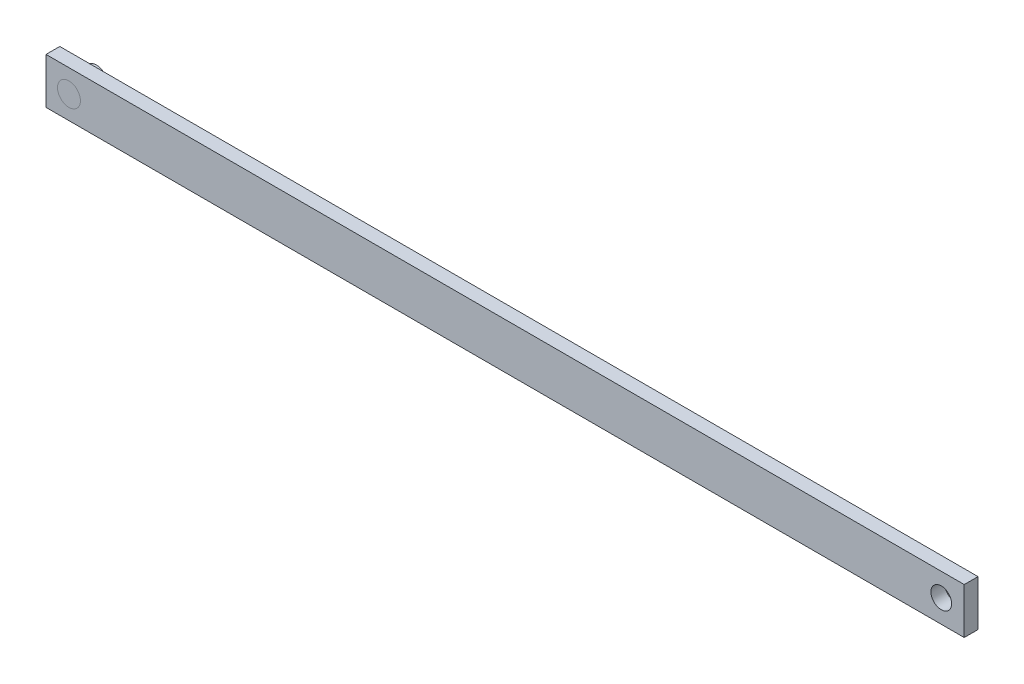
ISO-10303-21;
HEADER;
FILE_DESCRIPTION(('STEP AP214'),'2;1');
FILE_NAME('part.step','',(''),(''),'','','');
FILE_SCHEMA(('AUTOMOTIVE_DESIGN { 1 0 10303 214 1 1 1 1 }'));
ENDSEC;
DATA;
#1=APPLICATION_CONTEXT('core data for automotive mechanical design processes');
#2=APPLICATION_PROTOCOL_DEFINITION('international standard','automotive_design',2000,#1);
#3=PRODUCT_CONTEXT('',#1,'mechanical');
#4=PRODUCT('Part','Part','',(#3));
#5=PRODUCT_RELATED_PRODUCT_CATEGORY('part','',(#4));
#6=PRODUCT_DEFINITION_FORMATION('','',#4);
#7=PRODUCT_DEFINITION_CONTEXT('part definition',#1,'design');
#8=PRODUCT_DEFINITION('design','',#6,#7);
#9=PRODUCT_DEFINITION_SHAPE('','',#8);
#10=(LENGTH_UNIT() NAMED_UNIT(*) SI_UNIT(.MILLI.,.METRE.));
#11=(NAMED_UNIT(*) PLANE_ANGLE_UNIT() SI_UNIT($,.RADIAN.));
#12=(NAMED_UNIT(*) SI_UNIT($,.STERADIAN.) SOLID_ANGLE_UNIT());
#13=UNCERTAINTY_MEASURE_WITH_UNIT(LENGTH_MEASURE(1.E-05),#10,'distance_accuracy_value','');
#14=(GEOMETRIC_REPRESENTATION_CONTEXT(3) GLOBAL_UNCERTAINTY_ASSIGNED_CONTEXT((#13)) GLOBAL_UNIT_ASSIGNED_CONTEXT((#10,
#11,#12)) REPRESENTATION_CONTEXT('',''));
#15=CARTESIAN_POINT('',(0.,0.,0.));
#16=DIRECTION('',(0.,0.,1.));
#17=DIRECTION('',(1.,0.,0.));
#18=AXIS2_PLACEMENT_3D('',#15,#16,#17);
#19=CARTESIAN_POINT('',(-190.,0.,-6.));
#20=DIRECTION('',(0.,0.,1.));
#21=DIRECTION('',(1.,0.,0.));
#22=AXIS2_PLACEMENT_3D('',#19,#20,#21);
#23=CYLINDRICAL_SURFACE('',#22,4.99999999999999);
#24=CARTESIAN_POINT('',(-190.,0.,-6.));
#25=DIRECTION('',(0.,0.,1.));
#26=DIRECTION('',(1.,0.,0.));
#27=AXIS2_PLACEMENT_3D('',#24,#25,#26);
#28=CIRCLE('',#27,4.99999999999999);
#29=CARTESIAN_POINT('',(-185.,0.,-6.));
#30=VERTEX_POINT('',#29);
#31=EDGE_CURVE('E11',#30,#30,#28,.T.);
#32=ORIENTED_EDGE('',*,*,#31,.T.);
#33=EDGE_LOOP('',(#32));
#34=FACE_BOUND('',#33,.T.);
#35=CARTESIAN_POINT('',(-190.,0.,6.));
#36=DIRECTION('',(0.,0.,1.));
#37=DIRECTION('',(1.,0.,0.));
#38=AXIS2_PLACEMENT_3D('',#35,#36,#37);
#39=CIRCLE('',#38,4.99999999999999);
#40=CARTESIAN_POINT('',(-185.,0.,6.));
#41=VERTEX_POINT('',#40);
#42=EDGE_CURVE('E56',#41,#41,#39,.T.);
#43=ORIENTED_EDGE('',*,*,#42,.F.);
#44=EDGE_LOOP('',(#43));
#45=FACE_BOUND('',#44,.T.);
#46=ADVANCED_FACE('F53',(#34,#45),#23,.T.);
#47=CARTESIAN_POINT('',(-190.,0.,-6.));
#48=DIRECTION('',(0.,0.,1.));
#49=DIRECTION('',(1.,0.,0.));
#50=AXIS2_PLACEMENT_3D('',#47,#48,#49);
#51=PLANE('',#50);
#52=ORIENTED_EDGE('',*,*,#31,.F.);
#53=EDGE_LOOP('',(#52));
#54=FACE_BOUND('',#53,.T.);
#55=ADVANCED_FACE('F68',(#54),#51,.F.);
#56=CARTESIAN_POINT('',(-190.,0.,6.));
#57=DIRECTION('',(0.,0.,1.));
#58=DIRECTION('',(1.,0.,0.));
#59=AXIS2_PLACEMENT_3D('',#56,#57,#58);
#60=PLANE('',#59);
#61=ORIENTED_EDGE('',*,*,#42,.T.);
#62=EDGE_LOOP('',(#61));
#63=FACE_BOUND('',#62,.T.);
#64=ADVANCED_FACE('F65',(#63),#60,.T.);
#65=CLOSED_SHELL('',(#46,#55,#64));
#66=MANIFOLD_SOLID_BREP('B2',#65);
#67=CARTESIAN_POINT('',(200.,-10.,6.));
#68=DIRECTION('',(-1.,0.,0.));
#69=DIRECTION('',(0.,0.,1.));
#70=AXIS2_PLACEMENT_3D('',#67,#68,#69);
#71=PLANE('',#70);
#72=DIRECTION('',(0.,1.,0.));
#73=VECTOR('',#72,1.);
#74=CARTESIAN_POINT('',(200.,-10.,0.));
#75=LINE('',#74,#73);
#76=CARTESIAN_POINT('',(200.,-10.,0.));
#77=VERTEX_POINT('',#76);
#78=CARTESIAN_POINT('',(200.,10.,0.));
#79=VERTEX_POINT('',#78);
#80=EDGE_CURVE('E169',#77,#79,#75,.T.);
#81=ORIENTED_EDGE('',*,*,#80,.T.);
#82=DIRECTION('',(0.,0.,-1.));
#83=VECTOR('',#82,1.);
#84=CARTESIAN_POINT('',(200.,10.,6.));
#85=LINE('',#84,#83);
#86=CARTESIAN_POINT('',(200.,10.,6.));
#87=VERTEX_POINT('',#86);
#88=EDGE_CURVE('E51',#87,#79,#85,.T.);
#89=ORIENTED_EDGE('',*,*,#88,.F.);
#90=DIRECTION('',(0.,1.,0.));
#91=VECTOR('',#90,1.);
#92=CARTESIAN_POINT('',(200.,-10.,6.));
#93=LINE('',#92,#91);
#94=CARTESIAN_POINT('',(200.,-10.,6.));
#95=VERTEX_POINT('',#94);
#96=EDGE_CURVE('E157',#95,#87,#93,.T.);
#97=ORIENTED_EDGE('',*,*,#96,.F.);
#98=DIRECTION('',(0.,0.,-1.));
#99=VECTOR('',#98,1.);
#100=CARTESIAN_POINT('',(200.,-10.,6.));
#101=LINE('',#100,#99);
#102=EDGE_CURVE('E165',#95,#77,#101,.T.);
#103=ORIENTED_EDGE('',*,*,#102,.T.);
#104=EDGE_LOOP('',(#81,#89,#97,#103));
#105=FACE_BOUND('',#104,.T.);
#106=ADVANCED_FACE('F106',(#105),#71,.F.);
#107=CARTESIAN_POINT('',(-200.,10.,6.));
#108=DIRECTION('',(0.,-1.,0.));
#109=DIRECTION('',(0.,0.,-1.));
#110=AXIS2_PLACEMENT_3D('',#107,#108,#109);
#111=PLANE('',#110);
#112=DIRECTION('',(-1.,0.,0.));
#113=VECTOR('',#112,1.);
#114=CARTESIAN_POINT('',(-200.,10.,0.));
#115=LINE('',#114,#113);
#116=CARTESIAN_POINT('',(-200.,10.,0.));
#117=VERTEX_POINT('',#116);
#118=EDGE_CURVE('E161',#79,#117,#115,.T.);
#119=ORIENTED_EDGE('',*,*,#118,.T.);
#120=DIRECTION('',(0.,0.,-1.));
#121=VECTOR('',#120,1.);
#122=CARTESIAN_POINT('',(-200.,10.,6.));
#123=LINE('',#122,#121);
#124=CARTESIAN_POINT('',(-200.,10.,6.));
#125=VERTEX_POINT('',#124);
#126=EDGE_CURVE('E114',#125,#117,#123,.T.);
#127=ORIENTED_EDGE('',*,*,#126,.F.);
#128=DIRECTION('',(-1.,0.,0.));
#129=VECTOR('',#128,1.);
#130=CARTESIAN_POINT('',(-200.,10.,6.));
#131=LINE('',#130,#129);
#132=EDGE_CURVE('E152',#87,#125,#131,.T.);
#133=ORIENTED_EDGE('',*,*,#132,.F.);
#134=ORIENTED_EDGE('',*,*,#88,.T.);
#135=EDGE_LOOP('',(#119,#127,#133,#134));
#136=FACE_BOUND('',#135,.T.);
#137=ADVANCED_FACE('F160',(#136),#111,.F.);
#138=CARTESIAN_POINT('',(-200.,-10.,6.));
#139=DIRECTION('',(1.,0.,0.));
#140=DIRECTION('',(0.,0.,-1.));
#141=AXIS2_PLACEMENT_3D('',#138,#139,#140);
#142=PLANE('',#141);
#143=DIRECTION('',(0.,-1.,0.));
#144=VECTOR('',#143,1.);
#145=CARTESIAN_POINT('',(-200.,-10.,0.));
#146=LINE('',#145,#144);
#147=CARTESIAN_POINT('',(-200.,-10.,0.));
#148=VERTEX_POINT('',#147);
#149=EDGE_CURVE('E139',#117,#148,#146,.T.);
#150=ORIENTED_EDGE('',*,*,#149,.T.);
#151=DIRECTION('',(0.,0.,-1.));
#152=VECTOR('',#151,1.);
#153=CARTESIAN_POINT('',(-200.,-10.,6.));
#154=LINE('',#153,#152);
#155=CARTESIAN_POINT('',(-200.,-10.,6.));
#156=VERTEX_POINT('',#155);
#157=EDGE_CURVE('E162',#156,#148,#154,.T.);
#158=ORIENTED_EDGE('',*,*,#157,.F.);
#159=DIRECTION('',(0.,-1.,0.));
#160=VECTOR('',#159,1.);
#161=CARTESIAN_POINT('',(-200.,-10.,6.));
#162=LINE('',#161,#160);
#163=EDGE_CURVE('E155',#125,#156,#162,.T.);
#164=ORIENTED_EDGE('',*,*,#163,.F.);
#165=ORIENTED_EDGE('',*,*,#126,.T.);
#166=EDGE_LOOP('',(#150,#158,#164,#165));
#167=FACE_BOUND('',#166,.T.);
#168=ADVANCED_FACE('F163',(#167),#142,.F.);
#169=CARTESIAN_POINT('',(-200.,-10.,6.));
#170=DIRECTION('',(0.,1.,0.));
#171=DIRECTION('',(0.,0.,1.));
#172=AXIS2_PLACEMENT_3D('',#169,#170,#171);
#173=PLANE('',#172);
#174=DIRECTION('',(1.,0.,0.));
#175=VECTOR('',#174,1.);
#176=CARTESIAN_POINT('',(-200.,-10.,0.));
#177=LINE('',#176,#175);
#178=EDGE_CURVE('E145',#148,#77,#177,.T.);
#179=ORIENTED_EDGE('',*,*,#178,.T.);
#180=ORIENTED_EDGE('',*,*,#102,.F.);
#181=DIRECTION('',(1.,0.,0.));
#182=VECTOR('',#181,1.);
#183=CARTESIAN_POINT('',(-200.,-10.,6.));
#184=LINE('',#183,#182);
#185=EDGE_CURVE('E122',#156,#95,#184,.T.);
#186=ORIENTED_EDGE('',*,*,#185,.F.);
#187=ORIENTED_EDGE('',*,*,#157,.T.);
#188=EDGE_LOOP('',(#179,#180,#186,#187));
#189=FACE_BOUND('',#188,.T.);
#190=ADVANCED_FACE('F177',(#189),#173,.F.);
#191=CARTESIAN_POINT('',(0.,0.,6.));
#192=DIRECTION('',(0.,0.,-1.));
#193=DIRECTION('',(-1.,0.,0.));
#194=AXIS2_PLACEMENT_3D('',#191,#192,#193);
#195=PLANE('',#194);
#196=CARTESIAN_POINT('',(190.,0.,6.));
#197=DIRECTION('',(0.,0.,1.));
#198=DIRECTION('',(1.,0.,0.));
#199=AXIS2_PLACEMENT_3D('',#196,#197,#198);
#200=CIRCLE('',#199,4.49999999999999);
#201=CARTESIAN_POINT('',(194.5,0.,6.));
#202=VERTEX_POINT('',#201);
#203=EDGE_CURVE('E189',#202,#202,#200,.T.);
#204=ORIENTED_EDGE('',*,*,#203,.F.);
#205=EDGE_LOOP('',(#204));
#206=FACE_BOUND('',#205,.T.);
#207=CARTESIAN_POINT('',(-190.,0.,6.));
#208=DIRECTION('',(0.,0.,1.));
#209=DIRECTION('',(1.,0.,0.));
#210=AXIS2_PLACEMENT_3D('',#207,#208,#209);
#211=CIRCLE('',#210,4.99999999999999);
#212=CARTESIAN_POINT('',(-185.,0.,6.));
#213=VERTEX_POINT('',#212);
#214=EDGE_CURVE('E186',#213,#213,#211,.T.);
#215=ORIENTED_EDGE('',*,*,#214,.F.);
#216=EDGE_LOOP('',(#215));
#217=FACE_BOUND('',#216,.T.);
#218=ORIENTED_EDGE('',*,*,#96,.T.);
#219=ORIENTED_EDGE('',*,*,#132,.T.);
#220=ORIENTED_EDGE('',*,*,#163,.T.);
#221=ORIENTED_EDGE('',*,*,#185,.T.);
#222=EDGE_LOOP('',(#218,#219,#220,#221));
#223=FACE_BOUND('',#222,.T.);
#224=ADVANCED_FACE('F153',(#206,#217,#223),#195,.F.);
#225=CARTESIAN_POINT('',(0.,0.,0.));
#226=DIRECTION('',(0.,0.,-1.));
#227=DIRECTION('',(-1.,0.,0.));
#228=AXIS2_PLACEMENT_3D('',#225,#226,#227);
#229=PLANE('',#228);
#230=CARTESIAN_POINT('',(190.,0.,0.));
#231=DIRECTION('',(0.,0.,1.));
#232=DIRECTION('',(1.,0.,0.));
#233=AXIS2_PLACEMENT_3D('',#230,#231,#232);
#234=CIRCLE('',#233,4.49999999999999);
#235=CARTESIAN_POINT('',(194.5,0.,0.));
#236=VERTEX_POINT('',#235);
#237=EDGE_CURVE('E172',#236,#236,#234,.T.);
#238=ORIENTED_EDGE('',*,*,#237,.T.);
#239=EDGE_LOOP('',(#238));
#240=FACE_BOUND('',#239,.T.);
#241=CARTESIAN_POINT('',(-190.,0.,0.));
#242=DIRECTION('',(0.,0.,1.));
#243=DIRECTION('',(1.,0.,0.));
#244=AXIS2_PLACEMENT_3D('',#241,#242,#243);
#245=CIRCLE('',#244,4.99999999999999);
#246=CARTESIAN_POINT('',(-185.,0.,0.));
#247=VERTEX_POINT('',#246);
#248=EDGE_CURVE('E183',#247,#247,#245,.T.);
#249=ORIENTED_EDGE('',*,*,#248,.T.);
#250=EDGE_LOOP('',(#249));
#251=FACE_BOUND('',#250,.T.);
#252=ORIENTED_EDGE('',*,*,#80,.F.);
#253=ORIENTED_EDGE('',*,*,#178,.F.);
#254=ORIENTED_EDGE('',*,*,#149,.F.);
#255=ORIENTED_EDGE('',*,*,#118,.F.);
#256=EDGE_LOOP('',(#252,#253,#254,#255));
#257=FACE_BOUND('',#256,.T.);
#258=ADVANCED_FACE('F180',(#240,#251,#257),#229,.T.);
#259=CARTESIAN_POINT('',(-190.,0.,0.));
#260=DIRECTION('',(0.,0.,1.));
#261=DIRECTION('',(1.,0.,0.));
#262=AXIS2_PLACEMENT_3D('',#259,#260,#261);
#263=CYLINDRICAL_SURFACE('',#262,4.99999999999999);
#264=ORIENTED_EDGE('',*,*,#248,.F.);
#265=EDGE_LOOP('',(#264));
#266=FACE_BOUND('',#265,.T.);
#267=ORIENTED_EDGE('',*,*,#214,.T.);
#268=EDGE_LOOP('',(#267));
#269=FACE_BOUND('',#268,.T.);
#270=ADVANCED_FACE('F200',(#266,#269),#263,.F.);
#271=CARTESIAN_POINT('',(190.,0.,0.));
#272=DIRECTION('',(0.,0.,1.));
#273=DIRECTION('',(1.,0.,0.));
#274=AXIS2_PLACEMENT_3D('',#271,#272,#273);
#275=CYLINDRICAL_SURFACE('',#274,4.49999999999999);
#276=ORIENTED_EDGE('',*,*,#237,.F.);
#277=EDGE_LOOP('',(#276));
#278=FACE_BOUND('',#277,.T.);
#279=ORIENTED_EDGE('',*,*,#203,.T.);
#280=EDGE_LOOP('',(#279));
#281=FACE_BOUND('',#280,.T.);
#282=ADVANCED_FACE('F197',(#278,#281),#275,.F.);
#283=CLOSED_SHELL('',(#106,#137,#168,#190,#224,#258,#270,#282));
#284=MANIFOLD_SOLID_BREP('B6',#283);
#285=ADVANCED_BREP_SHAPE_REPRESENTATION('',(#18,#66,#284),#14);
#286=SHAPE_DEFINITION_REPRESENTATION(#9,#285);
ENDSEC;
END-ISO-10303-21;
